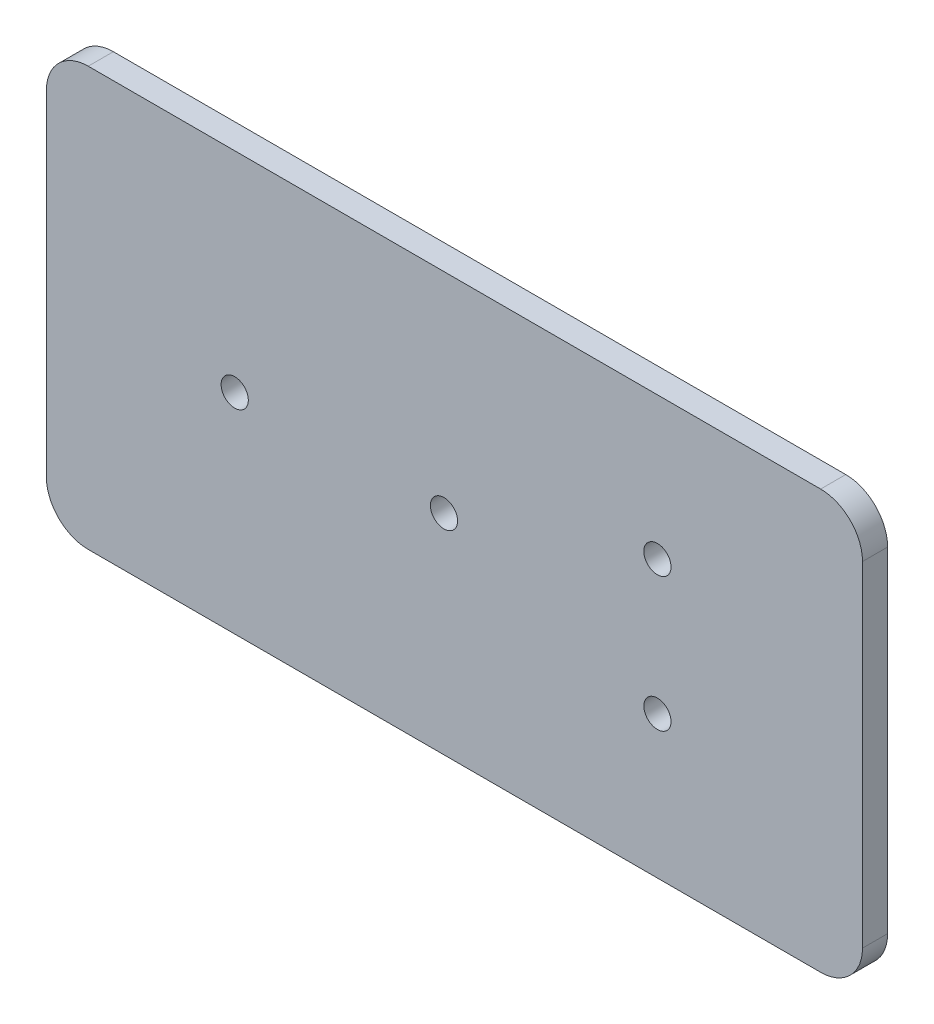
ISO-10303-21;
HEADER;
FILE_DESCRIPTION(('STEP AP214'),'2;1');
FILE_NAME('part.step','',(''),(''),'','','');
FILE_SCHEMA(('AUTOMOTIVE_DESIGN { 1 0 10303 214 1 1 1 1 }'));
ENDSEC;
DATA;
#1=APPLICATION_CONTEXT('core data for automotive mechanical design processes');
#2=APPLICATION_PROTOCOL_DEFINITION('international standard','automotive_design',2000,#1);
#3=PRODUCT_CONTEXT('',#1,'mechanical');
#4=PRODUCT('Part','Part','',(#3));
#5=PRODUCT_RELATED_PRODUCT_CATEGORY('part','',(#4));
#6=PRODUCT_DEFINITION_FORMATION('','',#4);
#7=PRODUCT_DEFINITION_CONTEXT('part definition',#1,'design');
#8=PRODUCT_DEFINITION('design','',#6,#7);
#9=PRODUCT_DEFINITION_SHAPE('','',#8);
#10=(LENGTH_UNIT() NAMED_UNIT(*) SI_UNIT(.MILLI.,.METRE.));
#11=(NAMED_UNIT(*) PLANE_ANGLE_UNIT() SI_UNIT($,.RADIAN.));
#12=(NAMED_UNIT(*) SI_UNIT($,.STERADIAN.) SOLID_ANGLE_UNIT());
#13=UNCERTAINTY_MEASURE_WITH_UNIT(LENGTH_MEASURE(1.E-05),#10,'distance_accuracy_value','');
#14=(GEOMETRIC_REPRESENTATION_CONTEXT(3) GLOBAL_UNCERTAINTY_ASSIGNED_CONTEXT((#13)) GLOBAL_UNIT_ASSIGNED_CONTEXT((#10,
#11,#12)) REPRESENTATION_CONTEXT('',''));
#15=CARTESIAN_POINT('',(0.,0.,0.));
#16=DIRECTION('',(0.,0.,1.));
#17=DIRECTION('',(1.,0.,0.));
#18=AXIS2_PLACEMENT_3D('',#15,#16,#17);
#19=CARTESIAN_POINT('',(-92.8827641283994,-60.4832942021949,-1.));
#20=DIRECTION('',(0.,-1.,0.));
#21=DIRECTION('',(0.,0.,-1.));
#22=AXIS2_PLACEMENT_3D('',#19,#20,#21);
#23=PLANE('',#22);
#24=DIRECTION('',(1.,0.,0.));
#25=VECTOR('',#24,1.);
#26=CARTESIAN_POINT('',(-92.8827641283994,-60.4832942021949,5.));
#27=LINE('',#26,#25);
#28=CARTESIAN_POINT('',(-82.8827641283994,-60.4832942021949,5.));
#29=VERTEX_POINT('',#28);
#30=CARTESIAN_POINT('',(92.1172358716006,-60.4832942021949,5.));
#31=VERTEX_POINT('',#30);
#32=EDGE_CURVE('E155',#29,#31,#27,.T.);
#33=ORIENTED_EDGE('',*,*,#32,.F.);
#34=DIRECTION('',(0.,0.,1.));
#35=VECTOR('',#34,1.);
#36=CARTESIAN_POINT('',(-82.8827641283994,-60.4832942021949,-1.));
#37=LINE('',#36,#35);
#38=CARTESIAN_POINT('',(-82.8827641283994,-60.4832942021949,-1.));
#39=VERTEX_POINT('',#38);
#40=EDGE_CURVE('E146',#29,#39,#37,.F.);
#41=ORIENTED_EDGE('',*,*,#40,.T.);
#42=DIRECTION('',(1.,0.,0.));
#43=VECTOR('',#42,1.);
#44=CARTESIAN_POINT('',(-92.8827641283994,-60.4832942021949,-1.));
#45=LINE('',#44,#43);
#46=CARTESIAN_POINT('',(92.1172358716006,-60.4832942021949,-1.));
#47=VERTEX_POINT('',#46);
#48=EDGE_CURVE('E152',#39,#47,#45,.T.);
#49=ORIENTED_EDGE('',*,*,#48,.T.);
#50=DIRECTION('',(0.,0.,1.));
#51=VECTOR('',#50,1.);
#52=CARTESIAN_POINT('',(92.1172358716006,-60.4832942021949,-1.));
#53=LINE('',#52,#51);
#54=EDGE_CURVE('E143',#47,#31,#53,.T.);
#55=ORIENTED_EDGE('',*,*,#54,.T.);
#56=EDGE_LOOP('',(#33,#41,#49,#55));
#57=FACE_BOUND('',#56,.T.);
#58=ADVANCED_FACE('F32',(#57),#23,.T.);
#59=CARTESIAN_POINT('',(-92.8827641283994,39.5167057978051,-1.));
#60=DIRECTION('',(-1.,0.,0.));
#61=DIRECTION('',(0.,-1.,0.));
#62=AXIS2_PLACEMENT_3D('',#59,#60,#61);
#63=PLANE('',#62);
#64=DIRECTION('',(0.,-1.,0.));
#65=VECTOR('',#64,1.);
#66=CARTESIAN_POINT('',(-92.8827641283994,39.5167057978051,5.));
#67=LINE('',#66,#65);
#68=CARTESIAN_POINT('',(-92.8827641283994,29.5167057978051,5.));
#69=VERTEX_POINT('',#68);
#70=CARTESIAN_POINT('',(-92.8827641283994,-50.4832942021949,5.));
#71=VERTEX_POINT('',#70);
#72=EDGE_CURVE('E116',#69,#71,#67,.T.);
#73=ORIENTED_EDGE('',*,*,#72,.F.);
#74=DIRECTION('',(0.,0.,1.));
#75=VECTOR('',#74,1.);
#76=CARTESIAN_POINT('',(-92.8827641283994,29.5167057978051,-1.));
#77=LINE('',#76,#75);
#78=CARTESIAN_POINT('',(-92.8827641283994,29.5167057978051,-1.));
#79=VERTEX_POINT('',#78);
#80=EDGE_CURVE('E134',#69,#79,#77,.F.);
#81=ORIENTED_EDGE('',*,*,#80,.T.);
#82=DIRECTION('',(0.,-1.,0.));
#83=VECTOR('',#82,1.);
#84=CARTESIAN_POINT('',(-92.8827641283994,39.5167057978051,-1.));
#85=LINE('',#84,#83);
#86=CARTESIAN_POINT('',(-92.8827641283994,-50.4832942021949,-1.));
#87=VERTEX_POINT('',#86);
#88=EDGE_CURVE('E119',#79,#87,#85,.T.);
#89=ORIENTED_EDGE('',*,*,#88,.T.);
#90=DIRECTION('',(0.,0.,1.));
#91=VECTOR('',#90,1.);
#92=CARTESIAN_POINT('',(-92.8827641283994,-50.4832942021949,-1.));
#93=LINE('',#92,#91);
#94=EDGE_CURVE('E131',#87,#71,#93,.T.);
#95=ORIENTED_EDGE('',*,*,#94,.T.);
#96=EDGE_LOOP('',(#73,#81,#89,#95));
#97=FACE_BOUND('',#96,.T.);
#98=ADVANCED_FACE('F168',(#97),#63,.T.);
#99=CARTESIAN_POINT('',(102.117235871601,39.5167057978051,-1.));
#100=DIRECTION('',(0.,1.,0.));
#101=DIRECTION('',(-1.,0.,0.));
#102=AXIS2_PLACEMENT_3D('',#99,#100,#101);
#103=PLANE('',#102);
#104=DIRECTION('',(-1.,0.,0.));
#105=VECTOR('',#104,1.);
#106=CARTESIAN_POINT('',(102.117235871601,39.5167057978051,-1.));
#107=LINE('',#106,#105);
#108=CARTESIAN_POINT('',(92.1172358716006,39.5167057978051,-1.));
#109=VERTEX_POINT('',#108);
#110=CARTESIAN_POINT('',(-82.8827641283994,39.5167057978051,-1.));
#111=VERTEX_POINT('',#110);
#112=EDGE_CURVE('E123',#109,#111,#107,.T.);
#113=ORIENTED_EDGE('',*,*,#112,.T.);
#114=DIRECTION('',(0.,0.,1.));
#115=VECTOR('',#114,1.);
#116=CARTESIAN_POINT('',(-82.8827641283994,39.5167057978051,-1.));
#117=LINE('',#116,#115);
#118=CARTESIAN_POINT('',(-82.8827641283994,39.5167057978051,5.));
#119=VERTEX_POINT('',#118);
#120=EDGE_CURVE('E115',#111,#119,#117,.T.);
#121=ORIENTED_EDGE('',*,*,#120,.T.);
#122=DIRECTION('',(-1.,0.,0.));
#123=VECTOR('',#122,1.);
#124=CARTESIAN_POINT('',(102.117235871601,39.5167057978051,5.));
#125=LINE('',#124,#123);
#126=CARTESIAN_POINT('',(92.1172358716006,39.5167057978051,5.));
#127=VERTEX_POINT('',#126);
#128=EDGE_CURVE('E101',#127,#119,#125,.T.);
#129=ORIENTED_EDGE('',*,*,#128,.F.);
#130=DIRECTION('',(0.,0.,1.));
#131=VECTOR('',#130,1.);
#132=CARTESIAN_POINT('',(92.1172358716006,39.5167057978051,-1.));
#133=LINE('',#132,#131);
#134=EDGE_CURVE('E113',#127,#109,#133,.F.);
#135=ORIENTED_EDGE('',*,*,#134,.T.);
#136=EDGE_LOOP('',(#113,#121,#129,#135));
#137=FACE_BOUND('',#136,.T.);
#138=ADVANCED_FACE('F112',(#137),#103,.T.);
#139=CARTESIAN_POINT('',(102.117235871601,-60.4832942021949,-1.));
#140=DIRECTION('',(1.,0.,0.));
#141=DIRECTION('',(0.,0.,-1.));
#142=AXIS2_PLACEMENT_3D('',#139,#140,#141);
#143=PLANE('',#142);
#144=DIRECTION('',(0.,1.,0.));
#145=VECTOR('',#144,1.);
#146=CARTESIAN_POINT('',(102.117235871601,-60.4832942021949,-1.));
#147=LINE('',#146,#145);
#148=CARTESIAN_POINT('',(102.117235871601,-50.4832942021949,-1.));
#149=VERTEX_POINT('',#148);
#150=CARTESIAN_POINT('',(102.117235871601,29.5167057978051,-1.));
#151=VERTEX_POINT('',#150);
#152=EDGE_CURVE('E161',#149,#151,#147,.T.);
#153=ORIENTED_EDGE('',*,*,#152,.T.);
#154=DIRECTION('',(0.,0.,1.));
#155=VECTOR('',#154,1.);
#156=CARTESIAN_POINT('',(102.117235871601,29.5167057978051,-1.));
#157=LINE('',#156,#155);
#158=CARTESIAN_POINT('',(102.117235871601,29.5167057978051,5.));
#159=VERTEX_POINT('',#158);
#160=EDGE_CURVE('E11',#151,#159,#157,.T.);
#161=ORIENTED_EDGE('',*,*,#160,.T.);
#162=DIRECTION('',(0.,1.,0.));
#163=VECTOR('',#162,1.);
#164=CARTESIAN_POINT('',(102.117235871601,-60.4832942021949,5.));
#165=LINE('',#164,#163);
#166=CARTESIAN_POINT('',(102.117235871601,-50.4832942021949,5.));
#167=VERTEX_POINT('',#166);
#168=EDGE_CURVE('E102',#167,#159,#165,.T.);
#169=ORIENTED_EDGE('',*,*,#168,.F.);
#170=DIRECTION('',(0.,0.,1.));
#171=VECTOR('',#170,1.);
#172=CARTESIAN_POINT('',(102.117235871601,-50.4832942021949,-1.));
#173=LINE('',#172,#171);
#174=EDGE_CURVE('E40',#167,#149,#173,.F.);
#175=ORIENTED_EDGE('',*,*,#174,.T.);
#176=EDGE_LOOP('',(#153,#161,#169,#175));
#177=FACE_BOUND('',#176,.T.);
#178=ADVANCED_FACE('F242',(#177),#143,.T.);
#179=CARTESIAN_POINT('',(102.117235871601,-60.4832942021949,-1.));
#180=DIRECTION('',(0.,0.,1.));
#181=DIRECTION('',(1.,0.,0.));
#182=AXIS2_PLACEMENT_3D('',#179,#180,#181);
#183=PLANE('',#182);
#184=CARTESIAN_POINT('',(-47.8827641283994,-10.4832942021949,-1.));
#185=DIRECTION('',(0.,0.,1.));
#186=DIRECTION('',(1.,0.,0.));
#187=AXIS2_PLACEMENT_3D('',#184,#185,#186);
#188=CIRCLE('',#187,3.25);
#189=CARTESIAN_POINT('',(-44.6327641283994,-10.4832942021949,-1.));
#190=VERTEX_POINT('',#189);
#191=EDGE_CURVE('E196',#190,#190,#188,.T.);
#192=ORIENTED_EDGE('',*,*,#191,.T.);
#193=EDGE_LOOP('',(#192));
#194=FACE_BOUND('',#193,.T.);
#195=CARTESIAN_POINT('',(2.11723587160062,-10.4832942021949,-1.));
#196=DIRECTION('',(0.,0.,1.));
#197=DIRECTION('',(1.,0.,0.));
#198=AXIS2_PLACEMENT_3D('',#195,#196,#197);
#199=CIRCLE('',#198,3.25);
#200=CARTESIAN_POINT('',(5.36723587160062,-10.4832942021949,-1.));
#201=VERTEX_POINT('',#200);
#202=EDGE_CURVE('E190',#201,#201,#199,.T.);
#203=ORIENTED_EDGE('',*,*,#202,.T.);
#204=EDGE_LOOP('',(#203));
#205=FACE_BOUND('',#204,.T.);
#206=CARTESIAN_POINT('',(53.1172358716006,-26.4832942021949,-1.));
#207=DIRECTION('',(0.,0.,1.));
#208=DIRECTION('',(1.,0.,0.));
#209=AXIS2_PLACEMENT_3D('',#206,#207,#208);
#210=CIRCLE('',#209,3.25);
#211=CARTESIAN_POINT('',(56.3672358716006,-26.4832942021949,-1.));
#212=VERTEX_POINT('',#211);
#213=EDGE_CURVE('E184',#212,#212,#210,.T.);
#214=ORIENTED_EDGE('',*,*,#213,.T.);
#215=EDGE_LOOP('',(#214));
#216=FACE_BOUND('',#215,.T.);
#217=CARTESIAN_POINT('',(53.1172358716006,5.5167057978051,-1.));
#218=DIRECTION('',(0.,0.,1.));
#219=DIRECTION('',(1.,0.,0.));
#220=AXIS2_PLACEMENT_3D('',#217,#218,#219);
#221=CIRCLE('',#220,3.25);
#222=CARTESIAN_POINT('',(56.3672358716006,5.5167057978051,-1.));
#223=VERTEX_POINT('',#222);
#224=EDGE_CURVE('E177',#223,#223,#221,.T.);
#225=ORIENTED_EDGE('',*,*,#224,.T.);
#226=EDGE_LOOP('',(#225));
#227=FACE_BOUND('',#226,.T.);
#228=ORIENTED_EDGE('',*,*,#88,.F.);
#229=CARTESIAN_POINT('',(-82.8827641283994,29.5167057978051,-1.));
#230=DIRECTION('',(0.,0.,1.));
#231=DIRECTION('',(1.,0.,0.));
#232=AXIS2_PLACEMENT_3D('',#229,#230,#231);
#233=CIRCLE('',#232,10.);
#234=EDGE_CURVE('E141',#79,#111,#233,.F.);
#235=ORIENTED_EDGE('',*,*,#234,.T.);
#236=ORIENTED_EDGE('',*,*,#112,.F.);
#237=CARTESIAN_POINT('',(92.1172358716006,29.5167057978051,-1.));
#238=DIRECTION('',(0.,0.,1.));
#239=DIRECTION('',(1.,0.,0.));
#240=AXIS2_PLACEMENT_3D('',#237,#238,#239);
#241=CIRCLE('',#240,10.);
#242=EDGE_CURVE('E47',#109,#151,#241,.F.);
#243=ORIENTED_EDGE('',*,*,#242,.T.);
#244=ORIENTED_EDGE('',*,*,#152,.F.);
#245=CARTESIAN_POINT('',(92.1172358716006,-50.4832942021949,-1.));
#246=DIRECTION('',(0.,0.,1.));
#247=DIRECTION('',(1.,0.,0.));
#248=AXIS2_PLACEMENT_3D('',#245,#246,#247);
#249=CIRCLE('',#248,10.);
#250=EDGE_CURVE('E136',#149,#47,#249,.F.);
#251=ORIENTED_EDGE('',*,*,#250,.T.);
#252=ORIENTED_EDGE('',*,*,#48,.F.);
#253=CARTESIAN_POINT('',(-82.8827641283994,-50.4832942021949,-1.));
#254=DIRECTION('',(0.,0.,1.));
#255=DIRECTION('',(1.,0.,0.));
#256=AXIS2_PLACEMENT_3D('',#253,#254,#255);
#257=CIRCLE('',#256,10.);
#258=EDGE_CURVE('E139',#39,#87,#257,.F.);
#259=ORIENTED_EDGE('',*,*,#258,.T.);
#260=EDGE_LOOP('',(#228,#235,#236,#243,#244,#251,#252,#259));
#261=FACE_BOUND('',#260,.T.);
#262=ADVANCED_FACE('F159',(#194,#205,#216,#227,#261),#183,.F.);
#263=CARTESIAN_POINT('',(102.117235871601,-60.4832942021949,5.));
#264=DIRECTION('',(0.,0.,1.));
#265=DIRECTION('',(1.,0.,0.));
#266=AXIS2_PLACEMENT_3D('',#263,#264,#265);
#267=PLANE('',#266);
#268=CARTESIAN_POINT('',(-47.8827641283994,-10.4832942021949,5.));
#269=DIRECTION('',(0.,0.,1.));
#270=DIRECTION('',(1.,0.,0.));
#271=AXIS2_PLACEMENT_3D('',#268,#269,#270);
#272=CIRCLE('',#271,3.25);
#273=CARTESIAN_POINT('',(-44.6327641283994,-10.4832942021949,5.));
#274=VERTEX_POINT('',#273);
#275=EDGE_CURVE('E199',#274,#274,#272,.T.);
#276=ORIENTED_EDGE('',*,*,#275,.F.);
#277=EDGE_LOOP('',(#276));
#278=FACE_BOUND('',#277,.T.);
#279=CARTESIAN_POINT('',(2.11723587160062,-10.4832942021949,5.));
#280=DIRECTION('',(0.,0.,1.));
#281=DIRECTION('',(1.,0.,0.));
#282=AXIS2_PLACEMENT_3D('',#279,#280,#281);
#283=CIRCLE('',#282,3.25);
#284=CARTESIAN_POINT('',(5.36723587160062,-10.4832942021949,5.));
#285=VERTEX_POINT('',#284);
#286=EDGE_CURVE('E193',#285,#285,#283,.T.);
#287=ORIENTED_EDGE('',*,*,#286,.F.);
#288=EDGE_LOOP('',(#287));
#289=FACE_BOUND('',#288,.T.);
#290=CARTESIAN_POINT('',(53.1172358716006,-26.4832942021949,5.));
#291=DIRECTION('',(0.,0.,1.));
#292=DIRECTION('',(1.,0.,0.));
#293=AXIS2_PLACEMENT_3D('',#290,#291,#292);
#294=CIRCLE('',#293,3.25);
#295=CARTESIAN_POINT('',(56.3672358716006,-26.4832942021949,5.));
#296=VERTEX_POINT('',#295);
#297=EDGE_CURVE('E187',#296,#296,#294,.T.);
#298=ORIENTED_EDGE('',*,*,#297,.F.);
#299=EDGE_LOOP('',(#298));
#300=FACE_BOUND('',#299,.T.);
#301=CARTESIAN_POINT('',(53.1172358716006,5.5167057978051,5.));
#302=DIRECTION('',(0.,0.,1.));
#303=DIRECTION('',(1.,0.,0.));
#304=AXIS2_PLACEMENT_3D('',#301,#302,#303);
#305=CIRCLE('',#304,3.25);
#306=CARTESIAN_POINT('',(56.3672358716006,5.5167057978051,5.));
#307=VERTEX_POINT('',#306);
#308=EDGE_CURVE('E179',#307,#307,#305,.T.);
#309=ORIENTED_EDGE('',*,*,#308,.F.);
#310=EDGE_LOOP('',(#309));
#311=FACE_BOUND('',#310,.T.);
#312=ORIENTED_EDGE('',*,*,#128,.T.);
#313=CARTESIAN_POINT('',(-82.8827641283994,29.5167057978051,5.));
#314=DIRECTION('',(0.,0.,1.));
#315=DIRECTION('',(1.,0.,0.));
#316=AXIS2_PLACEMENT_3D('',#313,#314,#315);
#317=CIRCLE('',#316,10.);
#318=EDGE_CURVE('E129',#119,#69,#317,.T.);
#319=ORIENTED_EDGE('',*,*,#318,.T.);
#320=ORIENTED_EDGE('',*,*,#72,.T.);
#321=CARTESIAN_POINT('',(-82.8827641283994,-50.4832942021949,5.));
#322=DIRECTION('',(0.,0.,1.));
#323=DIRECTION('',(1.,0.,0.));
#324=AXIS2_PLACEMENT_3D('',#321,#322,#323);
#325=CIRCLE('',#324,10.);
#326=EDGE_CURVE('E106',#71,#29,#325,.T.);
#327=ORIENTED_EDGE('',*,*,#326,.T.);
#328=ORIENTED_EDGE('',*,*,#32,.T.);
#329=CARTESIAN_POINT('',(92.1172358716006,-50.4832942021949,5.));
#330=DIRECTION('',(0.,0.,1.));
#331=DIRECTION('',(1.,0.,0.));
#332=AXIS2_PLACEMENT_3D('',#329,#330,#331);
#333=CIRCLE('',#332,10.);
#334=EDGE_CURVE('E107',#31,#167,#333,.T.);
#335=ORIENTED_EDGE('',*,*,#334,.T.);
#336=ORIENTED_EDGE('',*,*,#168,.T.);
#337=CARTESIAN_POINT('',(92.1172358716006,29.5167057978051,5.));
#338=DIRECTION('',(0.,0.,1.));
#339=DIRECTION('',(1.,0.,0.));
#340=AXIS2_PLACEMENT_3D('',#337,#338,#339);
#341=CIRCLE('',#340,10.);
#342=EDGE_CURVE('E98',#159,#127,#341,.T.);
#343=ORIENTED_EDGE('',*,*,#342,.T.);
#344=EDGE_LOOP('',(#312,#319,#320,#327,#328,#335,#336,#343));
#345=FACE_BOUND('',#344,.T.);
#346=ADVANCED_FACE('F100',(#278,#289,#300,#311,#345),#267,.T.);
#347=CARTESIAN_POINT('',(53.1172358716006,5.5167057978051,-1.));
#348=DIRECTION('',(0.,0.,1.));
#349=DIRECTION('',(1.,0.,0.));
#350=AXIS2_PLACEMENT_3D('',#347,#348,#349);
#351=CYLINDRICAL_SURFACE('',#350,3.25);
#352=CARTESIAN_POINT('',(56.3672358716006,5.5167057978051,-1.));
#353=CARTESIAN_POINT('',(56.3672358716006,5.5167057978051,-0.937500000000001));
#354=CARTESIAN_POINT('',(56.3672358716006,5.5167057978051,-0.875000000000001));
#355=CARTESIAN_POINT('',(56.3672358716006,5.5167057978051,-0.750000000000001));
#356=CARTESIAN_POINT('',(56.3672358716006,5.5167057978051,-0.687500000000001));
#357=CARTESIAN_POINT('',(56.3672358716006,5.5167057978051,-0.562500000000001));
#358=CARTESIAN_POINT('',(56.3672358716006,5.5167057978051,-0.500000000000001));
#359=CARTESIAN_POINT('',(56.3672358716006,5.5167057978051,-0.375000000000001));
#360=CARTESIAN_POINT('',(56.3672358716006,5.5167057978051,-0.312500000000001));
#361=CARTESIAN_POINT('',(56.3672358716006,5.5167057978051,-0.187500000000001));
#362=CARTESIAN_POINT('',(56.3672358716006,5.5167057978051,-0.125000000000001));
#363=CARTESIAN_POINT('',(56.3672358716006,5.5167057978051,0.));
#364=CARTESIAN_POINT('',(56.3672358716006,5.5167057978051,0.0624999999999991));
#365=CARTESIAN_POINT('',(56.3672358716006,5.5167057978051,0.187499999999999));
#366=CARTESIAN_POINT('',(56.3672358716006,5.5167057978051,0.249999999999999));
#367=CARTESIAN_POINT('',(56.3672358716006,5.5167057978051,0.374999999999999));
#368=CARTESIAN_POINT('',(56.3672358716006,5.5167057978051,0.437499999999999));
#369=CARTESIAN_POINT('',(56.3672358716006,5.5167057978051,0.562499999999999));
#370=CARTESIAN_POINT('',(56.3672358716006,5.5167057978051,0.624999999999999));
#371=CARTESIAN_POINT('',(56.3672358716006,5.5167057978051,0.749999999999999));
#372=CARTESIAN_POINT('',(56.3672358716006,5.5167057978051,0.812499999999999));
#373=CARTESIAN_POINT('',(56.3672358716006,5.5167057978051,0.937499999999999));
#374=CARTESIAN_POINT('',(56.3672358716006,5.5167057978051,0.999999999999999));
#375=CARTESIAN_POINT('',(56.3672358716006,5.5167057978051,1.125));
#376=CARTESIAN_POINT('',(56.3672358716006,5.5167057978051,1.1875));
#377=CARTESIAN_POINT('',(56.3672358716006,5.5167057978051,1.3125));
#378=CARTESIAN_POINT('',(56.3672358716006,5.5167057978051,1.375));
#379=CARTESIAN_POINT('',(56.3672358716006,5.5167057978051,1.5));
#380=CARTESIAN_POINT('',(56.3672358716006,5.5167057978051,1.5625));
#381=CARTESIAN_POINT('',(56.3672358716006,5.5167057978051,1.6875));
#382=CARTESIAN_POINT('',(56.3672358716006,5.5167057978051,1.75));
#383=CARTESIAN_POINT('',(56.3672358716006,5.5167057978051,1.875));
#384=CARTESIAN_POINT('',(56.3672358716006,5.5167057978051,1.9375));
#385=CARTESIAN_POINT('',(56.3672358716006,5.5167057978051,2.0625));
#386=CARTESIAN_POINT('',(56.3672358716006,5.5167057978051,2.125));
#387=CARTESIAN_POINT('',(56.3672358716006,5.5167057978051,2.25));
#388=CARTESIAN_POINT('',(56.3672358716006,5.5167057978051,2.3125));
#389=CARTESIAN_POINT('',(56.3672358716006,5.5167057978051,2.4375));
#390=CARTESIAN_POINT('',(56.3672358716006,5.5167057978051,2.5));
#391=CARTESIAN_POINT('',(56.3672358716006,5.5167057978051,2.625));
#392=CARTESIAN_POINT('',(56.3672358716006,5.5167057978051,2.6875));
#393=CARTESIAN_POINT('',(56.3672358716006,5.5167057978051,2.8125));
#394=CARTESIAN_POINT('',(56.3672358716006,5.5167057978051,2.875));
#395=CARTESIAN_POINT('',(56.3672358716006,5.5167057978051,3.));
#396=CARTESIAN_POINT('',(56.3672358716006,5.5167057978051,3.0625));
#397=CARTESIAN_POINT('',(56.3672358716006,5.5167057978051,3.1875));
#398=CARTESIAN_POINT('',(56.3672358716006,5.5167057978051,3.25));
#399=CARTESIAN_POINT('',(56.3672358716006,5.5167057978051,3.375));
#400=CARTESIAN_POINT('',(56.3672358716006,5.5167057978051,3.4375));
#401=CARTESIAN_POINT('',(56.3672358716006,5.5167057978051,3.5625));
#402=CARTESIAN_POINT('',(56.3672358716006,5.5167057978051,3.625));
#403=CARTESIAN_POINT('',(56.3672358716006,5.5167057978051,3.75));
#404=CARTESIAN_POINT('',(56.3672358716006,5.5167057978051,3.8125));
#405=CARTESIAN_POINT('',(56.3672358716006,5.5167057978051,3.9375));
#406=CARTESIAN_POINT('',(56.3672358716006,5.5167057978051,4.));
#407=CARTESIAN_POINT('',(56.3672358716006,5.5167057978051,4.125));
#408=CARTESIAN_POINT('',(56.3672358716006,5.5167057978051,4.1875));
#409=CARTESIAN_POINT('',(56.3672358716006,5.5167057978051,4.3125));
#410=CARTESIAN_POINT('',(56.3672358716006,5.5167057978051,4.375));
#411=CARTESIAN_POINT('',(56.3672358716006,5.5167057978051,4.5));
#412=CARTESIAN_POINT('',(56.3672358716006,5.5167057978051,4.5625));
#413=CARTESIAN_POINT('',(56.3672358716006,5.5167057978051,4.6875));
#414=CARTESIAN_POINT('',(56.3672358716006,5.5167057978051,4.75));
#415=CARTESIAN_POINT('',(56.3672358716006,5.5167057978051,4.875));
#416=CARTESIAN_POINT('',(56.3672358716006,5.5167057978051,4.9375));
#417=CARTESIAN_POINT('',(56.3672358716006,5.5167057978051,5.));
#418=B_SPLINE_CURVE_WITH_KNOTS('',3,(#352,#353,#354,#355,#356,#357,#358,#359,#360,#361,#362,
#363,#364,#365,#366,#367,#368,#369,#370,#371,#372,#373,#374,#375,#376,#377,#378,#379,#380,#381,
#382,#383,#384,#385,#386,#387,#388,#389,#390,#391,#392,#393,#394,#395,#396,#397,#398,#399,#400,
#401,#402,#403,#404,#405,#406,#407,#408,#409,#410,#411,#412,#413,#414,#415,#416,#417),
.UNSPECIFIED.,.F.,.F.,(4,2,2,2,2,2,2,2,2,2,2,2,2,2,2,2,2,2,2,2,2,2,2,2,2,2,2,2,2,2,2,2,4),(0.,
0.1875,0.375,0.5625,0.75,0.9375,1.125,1.3125,1.5,1.6875,1.875,2.0625,2.25,2.4375,2.625,2.8125,
3.,3.1875,3.375,3.5625,3.75,3.9375,4.125,4.3125,4.5,4.6875,4.875,5.0625,5.25,5.4375,5.625,
5.8125,6.),.UNSPECIFIED.);
#419=EDGE_CURVE('BSEAM216',#223,#307,#418,.T.);
#420=ORIENTED_EDGE('',*,*,#224,.F.);
#421=ORIENTED_EDGE('',*,*,#308,.T.);
#422=ORIENTED_EDGE('',*,*,#419,.T.);
#423=ORIENTED_EDGE('',*,*,#419,.F.);
#424=EDGE_LOOP('',(#420,#422,#421,#423));
#425=FACE_BOUND('',#424,.T.);
#426=ADVANCED_FACE('F216',(#425),#351,.F.);
#427=CARTESIAN_POINT('',(53.1172358716006,-26.4832942021949,-1.));
#428=DIRECTION('',(0.,0.,1.));
#429=DIRECTION('',(1.,0.,0.));
#430=AXIS2_PLACEMENT_3D('',#427,#428,#429);
#431=CYLINDRICAL_SURFACE('',#430,3.25);
#432=CARTESIAN_POINT('',(56.3672358716006,-26.4832942021949,-1.));
#433=CARTESIAN_POINT('',(56.3672358716006,-26.4832942021949,-0.937500000000001));
#434=CARTESIAN_POINT('',(56.3672358716006,-26.4832942021949,-0.875000000000001));
#435=CARTESIAN_POINT('',(56.3672358716006,-26.4832942021949,-0.750000000000001));
#436=CARTESIAN_POINT('',(56.3672358716006,-26.4832942021949,-0.687500000000001));
#437=CARTESIAN_POINT('',(56.3672358716006,-26.4832942021949,-0.562500000000001));
#438=CARTESIAN_POINT('',(56.3672358716006,-26.4832942021949,-0.500000000000001));
#439=CARTESIAN_POINT('',(56.3672358716006,-26.4832942021949,-0.375000000000001));
#440=CARTESIAN_POINT('',(56.3672358716006,-26.4832942021949,-0.312500000000001));
#441=CARTESIAN_POINT('',(56.3672358716006,-26.4832942021949,-0.187500000000001));
#442=CARTESIAN_POINT('',(56.3672358716006,-26.4832942021949,-0.125000000000001));
#443=CARTESIAN_POINT('',(56.3672358716006,-26.4832942021949,0.));
#444=CARTESIAN_POINT('',(56.3672358716006,-26.4832942021949,0.0624999999999991));
#445=CARTESIAN_POINT('',(56.3672358716006,-26.4832942021949,0.187499999999999));
#446=CARTESIAN_POINT('',(56.3672358716006,-26.4832942021949,0.249999999999999));
#447=CARTESIAN_POINT('',(56.3672358716006,-26.4832942021949,0.374999999999999));
#448=CARTESIAN_POINT('',(56.3672358716006,-26.4832942021949,0.437499999999999));
#449=CARTESIAN_POINT('',(56.3672358716006,-26.4832942021949,0.562499999999999));
#450=CARTESIAN_POINT('',(56.3672358716006,-26.4832942021949,0.624999999999999));
#451=CARTESIAN_POINT('',(56.3672358716006,-26.4832942021949,0.749999999999999));
#452=CARTESIAN_POINT('',(56.3672358716006,-26.4832942021949,0.812499999999999));
#453=CARTESIAN_POINT('',(56.3672358716006,-26.4832942021949,0.937499999999999));
#454=CARTESIAN_POINT('',(56.3672358716006,-26.4832942021949,0.999999999999999));
#455=CARTESIAN_POINT('',(56.3672358716006,-26.4832942021949,1.125));
#456=CARTESIAN_POINT('',(56.3672358716006,-26.4832942021949,1.1875));
#457=CARTESIAN_POINT('',(56.3672358716006,-26.4832942021949,1.3125));
#458=CARTESIAN_POINT('',(56.3672358716006,-26.4832942021949,1.375));
#459=CARTESIAN_POINT('',(56.3672358716006,-26.4832942021949,1.5));
#460=CARTESIAN_POINT('',(56.3672358716006,-26.4832942021949,1.5625));
#461=CARTESIAN_POINT('',(56.3672358716006,-26.4832942021949,1.6875));
#462=CARTESIAN_POINT('',(56.3672358716006,-26.4832942021949,1.75));
#463=CARTESIAN_POINT('',(56.3672358716006,-26.4832942021949,1.875));
#464=CARTESIAN_POINT('',(56.3672358716006,-26.4832942021949,1.9375));
#465=CARTESIAN_POINT('',(56.3672358716006,-26.4832942021949,2.0625));
#466=CARTESIAN_POINT('',(56.3672358716006,-26.4832942021949,2.125));
#467=CARTESIAN_POINT('',(56.3672358716006,-26.4832942021949,2.25));
#468=CARTESIAN_POINT('',(56.3672358716006,-26.4832942021949,2.3125));
#469=CARTESIAN_POINT('',(56.3672358716006,-26.4832942021949,2.4375));
#470=CARTESIAN_POINT('',(56.3672358716006,-26.4832942021949,2.5));
#471=CARTESIAN_POINT('',(56.3672358716006,-26.4832942021949,2.625));
#472=CARTESIAN_POINT('',(56.3672358716006,-26.4832942021949,2.6875));
#473=CARTESIAN_POINT('',(56.3672358716006,-26.4832942021949,2.8125));
#474=CARTESIAN_POINT('',(56.3672358716006,-26.4832942021949,2.875));
#475=CARTESIAN_POINT('',(56.3672358716006,-26.4832942021949,3.));
#476=CARTESIAN_POINT('',(56.3672358716006,-26.4832942021949,3.0625));
#477=CARTESIAN_POINT('',(56.3672358716006,-26.4832942021949,3.1875));
#478=CARTESIAN_POINT('',(56.3672358716006,-26.4832942021949,3.25));
#479=CARTESIAN_POINT('',(56.3672358716006,-26.4832942021949,3.375));
#480=CARTESIAN_POINT('',(56.3672358716006,-26.4832942021949,3.4375));
#481=CARTESIAN_POINT('',(56.3672358716006,-26.4832942021949,3.5625));
#482=CARTESIAN_POINT('',(56.3672358716006,-26.4832942021949,3.625));
#483=CARTESIAN_POINT('',(56.3672358716006,-26.4832942021949,3.75));
#484=CARTESIAN_POINT('',(56.3672358716006,-26.4832942021949,3.8125));
#485=CARTESIAN_POINT('',(56.3672358716006,-26.4832942021949,3.9375));
#486=CARTESIAN_POINT('',(56.3672358716006,-26.4832942021949,4.));
#487=CARTESIAN_POINT('',(56.3672358716006,-26.4832942021949,4.125));
#488=CARTESIAN_POINT('',(56.3672358716006,-26.4832942021949,4.1875));
#489=CARTESIAN_POINT('',(56.3672358716006,-26.4832942021949,4.3125));
#490=CARTESIAN_POINT('',(56.3672358716006,-26.4832942021949,4.375));
#491=CARTESIAN_POINT('',(56.3672358716006,-26.4832942021949,4.5));
#492=CARTESIAN_POINT('',(56.3672358716006,-26.4832942021949,4.5625));
#493=CARTESIAN_POINT('',(56.3672358716006,-26.4832942021949,4.6875));
#494=CARTESIAN_POINT('',(56.3672358716006,-26.4832942021949,4.75));
#495=CARTESIAN_POINT('',(56.3672358716006,-26.4832942021949,4.875));
#496=CARTESIAN_POINT('',(56.3672358716006,-26.4832942021949,4.9375));
#497=CARTESIAN_POINT('',(56.3672358716006,-26.4832942021949,5.));
#498=B_SPLINE_CURVE_WITH_KNOTS('',3,(#432,#433,#434,#435,#436,#437,#438,#439,#440,#441,#442,
#443,#444,#445,#446,#447,#448,#449,#450,#451,#452,#453,#454,#455,#456,#457,#458,#459,#460,#461,
#462,#463,#464,#465,#466,#467,#468,#469,#470,#471,#472,#473,#474,#475,#476,#477,#478,#479,#480,
#481,#482,#483,#484,#485,#486,#487,#488,#489,#490,#491,#492,#493,#494,#495,#496,#497),
.UNSPECIFIED.,.F.,.F.,(4,2,2,2,2,2,2,2,2,2,2,2,2,2,2,2,2,2,2,2,2,2,2,2,2,2,2,2,2,2,2,2,4),(0.,
0.1875,0.375,0.5625,0.75,0.9375,1.125,1.3125,1.5,1.6875,1.875,2.0625,2.25,2.4375,2.625,2.8125,
3.,3.1875,3.375,3.5625,3.75,3.9375,4.125,4.3125,4.5,4.6875,4.875,5.0625,5.25,5.4375,5.625,
5.8125,6.),.UNSPECIFIED.);
#499=EDGE_CURVE('BSEAM225',#212,#296,#498,.T.);
#500=ORIENTED_EDGE('',*,*,#213,.F.);
#501=ORIENTED_EDGE('',*,*,#297,.T.);
#502=ORIENTED_EDGE('',*,*,#499,.T.);
#503=ORIENTED_EDGE('',*,*,#499,.F.);
#504=EDGE_LOOP('',(#500,#502,#501,#503));
#505=FACE_BOUND('',#504,.T.);
#506=ADVANCED_FACE('F225',(#505),#431,.F.);
#507=CARTESIAN_POINT('',(2.11723587160062,-10.4832942021949,-1.));
#508=DIRECTION('',(0.,0.,1.));
#509=DIRECTION('',(1.,0.,0.));
#510=AXIS2_PLACEMENT_3D('',#507,#508,#509);
#511=CYLINDRICAL_SURFACE('',#510,3.25);
#512=CARTESIAN_POINT('',(5.36723587160062,-10.4832942021949,-1.));
#513=CARTESIAN_POINT('',(5.36723587160062,-10.4832942021949,-0.937500000000001));
#514=CARTESIAN_POINT('',(5.36723587160062,-10.4832942021949,-0.875000000000001));
#515=CARTESIAN_POINT('',(5.36723587160062,-10.4832942021949,-0.750000000000001));
#516=CARTESIAN_POINT('',(5.36723587160062,-10.4832942021949,-0.687500000000001));
#517=CARTESIAN_POINT('',(5.36723587160062,-10.4832942021949,-0.562500000000001));
#518=CARTESIAN_POINT('',(5.36723587160062,-10.4832942021949,-0.500000000000001));
#519=CARTESIAN_POINT('',(5.36723587160062,-10.4832942021949,-0.375000000000001));
#520=CARTESIAN_POINT('',(5.36723587160062,-10.4832942021949,-0.312500000000001));
#521=CARTESIAN_POINT('',(5.36723587160062,-10.4832942021949,-0.187500000000001));
#522=CARTESIAN_POINT('',(5.36723587160062,-10.4832942021949,-0.125000000000001));
#523=CARTESIAN_POINT('',(5.36723587160062,-10.4832942021949,0.));
#524=CARTESIAN_POINT('',(5.36723587160062,-10.4832942021949,0.0624999999999991));
#525=CARTESIAN_POINT('',(5.36723587160062,-10.4832942021949,0.187499999999999));
#526=CARTESIAN_POINT('',(5.36723587160062,-10.4832942021949,0.249999999999999));
#527=CARTESIAN_POINT('',(5.36723587160062,-10.4832942021949,0.374999999999999));
#528=CARTESIAN_POINT('',(5.36723587160062,-10.4832942021949,0.437499999999999));
#529=CARTESIAN_POINT('',(5.36723587160062,-10.4832942021949,0.562499999999999));
#530=CARTESIAN_POINT('',(5.36723587160062,-10.4832942021949,0.624999999999999));
#531=CARTESIAN_POINT('',(5.36723587160062,-10.4832942021949,0.749999999999999));
#532=CARTESIAN_POINT('',(5.36723587160062,-10.4832942021949,0.812499999999999));
#533=CARTESIAN_POINT('',(5.36723587160062,-10.4832942021949,0.937499999999999));
#534=CARTESIAN_POINT('',(5.36723587160062,-10.4832942021949,0.999999999999999));
#535=CARTESIAN_POINT('',(5.36723587160062,-10.4832942021949,1.125));
#536=CARTESIAN_POINT('',(5.36723587160062,-10.4832942021949,1.1875));
#537=CARTESIAN_POINT('',(5.36723587160062,-10.4832942021949,1.3125));
#538=CARTESIAN_POINT('',(5.36723587160062,-10.4832942021949,1.375));
#539=CARTESIAN_POINT('',(5.36723587160062,-10.4832942021949,1.5));
#540=CARTESIAN_POINT('',(5.36723587160062,-10.4832942021949,1.5625));
#541=CARTESIAN_POINT('',(5.36723587160062,-10.4832942021949,1.6875));
#542=CARTESIAN_POINT('',(5.36723587160062,-10.4832942021949,1.75));
#543=CARTESIAN_POINT('',(5.36723587160062,-10.4832942021949,1.875));
#544=CARTESIAN_POINT('',(5.36723587160062,-10.4832942021949,1.9375));
#545=CARTESIAN_POINT('',(5.36723587160062,-10.4832942021949,2.0625));
#546=CARTESIAN_POINT('',(5.36723587160062,-10.4832942021949,2.125));
#547=CARTESIAN_POINT('',(5.36723587160062,-10.4832942021949,2.25));
#548=CARTESIAN_POINT('',(5.36723587160062,-10.4832942021949,2.3125));
#549=CARTESIAN_POINT('',(5.36723587160062,-10.4832942021949,2.4375));
#550=CARTESIAN_POINT('',(5.36723587160062,-10.4832942021949,2.5));
#551=CARTESIAN_POINT('',(5.36723587160062,-10.4832942021949,2.625));
#552=CARTESIAN_POINT('',(5.36723587160062,-10.4832942021949,2.6875));
#553=CARTESIAN_POINT('',(5.36723587160062,-10.4832942021949,2.8125));
#554=CARTESIAN_POINT('',(5.36723587160062,-10.4832942021949,2.875));
#555=CARTESIAN_POINT('',(5.36723587160062,-10.4832942021949,3.));
#556=CARTESIAN_POINT('',(5.36723587160062,-10.4832942021949,3.0625));
#557=CARTESIAN_POINT('',(5.36723587160062,-10.4832942021949,3.1875));
#558=CARTESIAN_POINT('',(5.36723587160062,-10.4832942021949,3.25));
#559=CARTESIAN_POINT('',(5.36723587160062,-10.4832942021949,3.375));
#560=CARTESIAN_POINT('',(5.36723587160062,-10.4832942021949,3.4375));
#561=CARTESIAN_POINT('',(5.36723587160062,-10.4832942021949,3.5625));
#562=CARTESIAN_POINT('',(5.36723587160062,-10.4832942021949,3.625));
#563=CARTESIAN_POINT('',(5.36723587160062,-10.4832942021949,3.75));
#564=CARTESIAN_POINT('',(5.36723587160062,-10.4832942021949,3.8125));
#565=CARTESIAN_POINT('',(5.36723587160062,-10.4832942021949,3.9375));
#566=CARTESIAN_POINT('',(5.36723587160062,-10.4832942021949,4.));
#567=CARTESIAN_POINT('',(5.36723587160062,-10.4832942021949,4.125));
#568=CARTESIAN_POINT('',(5.36723587160062,-10.4832942021949,4.1875));
#569=CARTESIAN_POINT('',(5.36723587160062,-10.4832942021949,4.3125));
#570=CARTESIAN_POINT('',(5.36723587160062,-10.4832942021949,4.375));
#571=CARTESIAN_POINT('',(5.36723587160062,-10.4832942021949,4.5));
#572=CARTESIAN_POINT('',(5.36723587160062,-10.4832942021949,4.5625));
#573=CARTESIAN_POINT('',(5.36723587160062,-10.4832942021949,4.6875));
#574=CARTESIAN_POINT('',(5.36723587160062,-10.4832942021949,4.75));
#575=CARTESIAN_POINT('',(5.36723587160062,-10.4832942021949,4.875));
#576=CARTESIAN_POINT('',(5.36723587160062,-10.4832942021949,4.9375));
#577=CARTESIAN_POINT('',(5.36723587160062,-10.4832942021949,5.));
#578=B_SPLINE_CURVE_WITH_KNOTS('',3,(#512,#513,#514,#515,#516,#517,#518,#519,#520,#521,#522,
#523,#524,#525,#526,#527,#528,#529,#530,#531,#532,#533,#534,#535,#536,#537,#538,#539,#540,#541,
#542,#543,#544,#545,#546,#547,#548,#549,#550,#551,#552,#553,#554,#555,#556,#557,#558,#559,#560,
#561,#562,#563,#564,#565,#566,#567,#568,#569,#570,#571,#572,#573,#574,#575,#576,#577),
.UNSPECIFIED.,.F.,.F.,(4,2,2,2,2,2,2,2,2,2,2,2,2,2,2,2,2,2,2,2,2,2,2,2,2,2,2,2,2,2,2,2,4),(0.,
0.1875,0.375,0.5625,0.75,0.9375,1.125,1.3125,1.5,1.6875,1.875,2.0625,2.25,2.4375,2.625,2.8125,
3.,3.1875,3.375,3.5625,3.75,3.9375,4.125,4.3125,4.5,4.6875,4.875,5.0625,5.25,5.4375,5.625,
5.8125,6.),.UNSPECIFIED.);
#579=EDGE_CURVE('BSEAM210',#201,#285,#578,.T.);
#580=ORIENTED_EDGE('',*,*,#202,.F.);
#581=ORIENTED_EDGE('',*,*,#286,.T.);
#582=ORIENTED_EDGE('',*,*,#579,.T.);
#583=ORIENTED_EDGE('',*,*,#579,.F.);
#584=EDGE_LOOP('',(#580,#582,#581,#583));
#585=FACE_BOUND('',#584,.T.);
#586=ADVANCED_FACE('F210',(#585),#511,.F.);
#587=CARTESIAN_POINT('',(-47.8827641283994,-10.4832942021949,-1.));
#588=DIRECTION('',(0.,0.,1.));
#589=DIRECTION('',(1.,0.,0.));
#590=AXIS2_PLACEMENT_3D('',#587,#588,#589);
#591=CYLINDRICAL_SURFACE('',#590,3.25);
#592=CARTESIAN_POINT('',(-44.6327641283994,-10.4832942021949,-1.));
#593=CARTESIAN_POINT('',(-44.6327641283994,-10.4832942021949,-0.937500000000001));
#594=CARTESIAN_POINT('',(-44.6327641283994,-10.4832942021949,-0.875000000000001));
#595=CARTESIAN_POINT('',(-44.6327641283994,-10.4832942021949,-0.750000000000001));
#596=CARTESIAN_POINT('',(-44.6327641283994,-10.4832942021949,-0.687500000000001));
#597=CARTESIAN_POINT('',(-44.6327641283994,-10.4832942021949,-0.562500000000001));
#598=CARTESIAN_POINT('',(-44.6327641283994,-10.4832942021949,-0.500000000000001));
#599=CARTESIAN_POINT('',(-44.6327641283994,-10.4832942021949,-0.375000000000001));
#600=CARTESIAN_POINT('',(-44.6327641283994,-10.4832942021949,-0.312500000000001));
#601=CARTESIAN_POINT('',(-44.6327641283994,-10.4832942021949,-0.187500000000001));
#602=CARTESIAN_POINT('',(-44.6327641283994,-10.4832942021949,-0.125000000000001));
#603=CARTESIAN_POINT('',(-44.6327641283994,-10.4832942021949,0.));
#604=CARTESIAN_POINT('',(-44.6327641283994,-10.4832942021949,0.0624999999999991));
#605=CARTESIAN_POINT('',(-44.6327641283994,-10.4832942021949,0.187499999999999));
#606=CARTESIAN_POINT('',(-44.6327641283994,-10.4832942021949,0.249999999999999));
#607=CARTESIAN_POINT('',(-44.6327641283994,-10.4832942021949,0.374999999999999));
#608=CARTESIAN_POINT('',(-44.6327641283994,-10.4832942021949,0.437499999999999));
#609=CARTESIAN_POINT('',(-44.6327641283994,-10.4832942021949,0.562499999999999));
#610=CARTESIAN_POINT('',(-44.6327641283994,-10.4832942021949,0.624999999999999));
#611=CARTESIAN_POINT('',(-44.6327641283994,-10.4832942021949,0.749999999999999));
#612=CARTESIAN_POINT('',(-44.6327641283994,-10.4832942021949,0.812499999999999));
#613=CARTESIAN_POINT('',(-44.6327641283994,-10.4832942021949,0.937499999999999));
#614=CARTESIAN_POINT('',(-44.6327641283994,-10.4832942021949,0.999999999999999));
#615=CARTESIAN_POINT('',(-44.6327641283994,-10.4832942021949,1.125));
#616=CARTESIAN_POINT('',(-44.6327641283994,-10.4832942021949,1.1875));
#617=CARTESIAN_POINT('',(-44.6327641283994,-10.4832942021949,1.3125));
#618=CARTESIAN_POINT('',(-44.6327641283994,-10.4832942021949,1.375));
#619=CARTESIAN_POINT('',(-44.6327641283994,-10.4832942021949,1.5));
#620=CARTESIAN_POINT('',(-44.6327641283994,-10.4832942021949,1.5625));
#621=CARTESIAN_POINT('',(-44.6327641283994,-10.4832942021949,1.6875));
#622=CARTESIAN_POINT('',(-44.6327641283994,-10.4832942021949,1.75));
#623=CARTESIAN_POINT('',(-44.6327641283994,-10.4832942021949,1.875));
#624=CARTESIAN_POINT('',(-44.6327641283994,-10.4832942021949,1.9375));
#625=CARTESIAN_POINT('',(-44.6327641283994,-10.4832942021949,2.0625));
#626=CARTESIAN_POINT('',(-44.6327641283994,-10.4832942021949,2.125));
#627=CARTESIAN_POINT('',(-44.6327641283994,-10.4832942021949,2.25));
#628=CARTESIAN_POINT('',(-44.6327641283994,-10.4832942021949,2.3125));
#629=CARTESIAN_POINT('',(-44.6327641283994,-10.4832942021949,2.4375));
#630=CARTESIAN_POINT('',(-44.6327641283994,-10.4832942021949,2.5));
#631=CARTESIAN_POINT('',(-44.6327641283994,-10.4832942021949,2.625));
#632=CARTESIAN_POINT('',(-44.6327641283994,-10.4832942021949,2.6875));
#633=CARTESIAN_POINT('',(-44.6327641283994,-10.4832942021949,2.8125));
#634=CARTESIAN_POINT('',(-44.6327641283994,-10.4832942021949,2.875));
#635=CARTESIAN_POINT('',(-44.6327641283994,-10.4832942021949,3.));
#636=CARTESIAN_POINT('',(-44.6327641283994,-10.4832942021949,3.0625));
#637=CARTESIAN_POINT('',(-44.6327641283994,-10.4832942021949,3.1875));
#638=CARTESIAN_POINT('',(-44.6327641283994,-10.4832942021949,3.25));
#639=CARTESIAN_POINT('',(-44.6327641283994,-10.4832942021949,3.375));
#640=CARTESIAN_POINT('',(-44.6327641283994,-10.4832942021949,3.4375));
#641=CARTESIAN_POINT('',(-44.6327641283994,-10.4832942021949,3.5625));
#642=CARTESIAN_POINT('',(-44.6327641283994,-10.4832942021949,3.625));
#643=CARTESIAN_POINT('',(-44.6327641283994,-10.4832942021949,3.75));
#644=CARTESIAN_POINT('',(-44.6327641283994,-10.4832942021949,3.8125));
#645=CARTESIAN_POINT('',(-44.6327641283994,-10.4832942021949,3.9375));
#646=CARTESIAN_POINT('',(-44.6327641283994,-10.4832942021949,4.));
#647=CARTESIAN_POINT('',(-44.6327641283994,-10.4832942021949,4.125));
#648=CARTESIAN_POINT('',(-44.6327641283994,-10.4832942021949,4.1875));
#649=CARTESIAN_POINT('',(-44.6327641283994,-10.4832942021949,4.3125));
#650=CARTESIAN_POINT('',(-44.6327641283994,-10.4832942021949,4.375));
#651=CARTESIAN_POINT('',(-44.6327641283994,-10.4832942021949,4.5));
#652=CARTESIAN_POINT('',(-44.6327641283994,-10.4832942021949,4.5625));
#653=CARTESIAN_POINT('',(-44.6327641283994,-10.4832942021949,4.6875));
#654=CARTESIAN_POINT('',(-44.6327641283994,-10.4832942021949,4.75));
#655=CARTESIAN_POINT('',(-44.6327641283994,-10.4832942021949,4.875));
#656=CARTESIAN_POINT('',(-44.6327641283994,-10.4832942021949,4.9375));
#657=CARTESIAN_POINT('',(-44.6327641283994,-10.4832942021949,5.));
#658=B_SPLINE_CURVE_WITH_KNOTS('',3,(#592,#593,#594,#595,#596,#597,#598,#599,#600,#601,#602,
#603,#604,#605,#606,#607,#608,#609,#610,#611,#612,#613,#614,#615,#616,#617,#618,#619,#620,#621,
#622,#623,#624,#625,#626,#627,#628,#629,#630,#631,#632,#633,#634,#635,#636,#637,#638,#639,#640,
#641,#642,#643,#644,#645,#646,#647,#648,#649,#650,#651,#652,#653,#654,#655,#656,#657),
.UNSPECIFIED.,.F.,.F.,(4,2,2,2,2,2,2,2,2,2,2,2,2,2,2,2,2,2,2,2,2,2,2,2,2,2,2,2,2,2,2,2,4),(0.,
0.1875,0.375,0.5625,0.75,0.9375,1.125,1.3125,1.5,1.6875,1.875,2.0625,2.25,2.4375,2.625,2.8125,
3.,3.1875,3.375,3.5625,3.75,3.9375,4.125,4.3125,4.5,4.6875,4.875,5.0625,5.25,5.4375,5.625,
5.8125,6.),.UNSPECIFIED.);
#659=EDGE_CURVE('BSEAM207',#190,#274,#658,.T.);
#660=ORIENTED_EDGE('',*,*,#191,.F.);
#661=ORIENTED_EDGE('',*,*,#275,.T.);
#662=ORIENTED_EDGE('',*,*,#659,.T.);
#663=ORIENTED_EDGE('',*,*,#659,.F.);
#664=EDGE_LOOP('',(#660,#662,#661,#663));
#665=FACE_BOUND('',#664,.T.);
#666=ADVANCED_FACE('F207',(#665),#591,.F.);
#667=CARTESIAN_POINT('',(-82.8827641283994,29.5167057978051,-1.));
#668=DIRECTION('',(0.,0.,1.));
#669=DIRECTION('',(1.,0.,0.));
#670=AXIS2_PLACEMENT_3D('',#667,#668,#669);
#671=CYLINDRICAL_SURFACE('',#670,10.);
#672=ORIENTED_EDGE('',*,*,#234,.F.);
#673=ORIENTED_EDGE('',*,*,#80,.F.);
#674=ORIENTED_EDGE('',*,*,#318,.F.);
#675=ORIENTED_EDGE('',*,*,#120,.F.);
#676=EDGE_LOOP('',(#672,#673,#674,#675));
#677=FACE_BOUND('',#676,.T.);
#678=ADVANCED_FACE('F172',(#677),#671,.T.);
#679=CARTESIAN_POINT('',(-82.8827641283994,-50.4832942021949,-1.));
#680=DIRECTION('',(0.,0.,1.));
#681=DIRECTION('',(1.,0.,0.));
#682=AXIS2_PLACEMENT_3D('',#679,#680,#681);
#683=CYLINDRICAL_SURFACE('',#682,10.);
#684=ORIENTED_EDGE('',*,*,#258,.F.);
#685=ORIENTED_EDGE('',*,*,#40,.F.);
#686=ORIENTED_EDGE('',*,*,#326,.F.);
#687=ORIENTED_EDGE('',*,*,#94,.F.);
#688=EDGE_LOOP('',(#684,#685,#686,#687));
#689=FACE_BOUND('',#688,.T.);
#690=ADVANCED_FACE('F164',(#689),#683,.T.);
#691=CARTESIAN_POINT('',(92.1172358716006,29.5167057978051,-1.));
#692=DIRECTION('',(0.,0.,1.));
#693=DIRECTION('',(1.,0.,0.));
#694=AXIS2_PLACEMENT_3D('',#691,#692,#693);
#695=CYLINDRICAL_SURFACE('',#694,10.);
#696=ORIENTED_EDGE('',*,*,#242,.F.);
#697=ORIENTED_EDGE('',*,*,#134,.F.);
#698=ORIENTED_EDGE('',*,*,#342,.F.);
#699=ORIENTED_EDGE('',*,*,#160,.F.);
#700=EDGE_LOOP('',(#696,#697,#698,#699));
#701=FACE_BOUND('',#700,.T.);
#702=ADVANCED_FACE('F118',(#701),#695,.T.);
#703=CARTESIAN_POINT('',(92.1172358716006,-50.4832942021949,-1.));
#704=DIRECTION('',(0.,0.,1.));
#705=DIRECTION('',(1.,0.,0.));
#706=AXIS2_PLACEMENT_3D('',#703,#704,#705);
#707=CYLINDRICAL_SURFACE('',#706,10.);
#708=ORIENTED_EDGE('',*,*,#250,.F.);
#709=ORIENTED_EDGE('',*,*,#174,.F.);
#710=ORIENTED_EDGE('',*,*,#334,.F.);
#711=ORIENTED_EDGE('',*,*,#54,.F.);
#712=EDGE_LOOP('',(#708,#709,#710,#711));
#713=FACE_BOUND('',#712,.T.);
#714=ADVANCED_FACE('F34',(#713),#707,.T.);
#715=CLOSED_SHELL('',(#58,#98,#138,#178,#262,#346,#426,#506,#586,#666,#678,#690,#702,#714));
#716=MANIFOLD_SOLID_BREP('B2',#715);
#717=ADVANCED_BREP_SHAPE_REPRESENTATION('',(#18,#716),#14);
#718=SHAPE_DEFINITION_REPRESENTATION(#9,#717);
ENDSEC;
END-ISO-10303-21;
